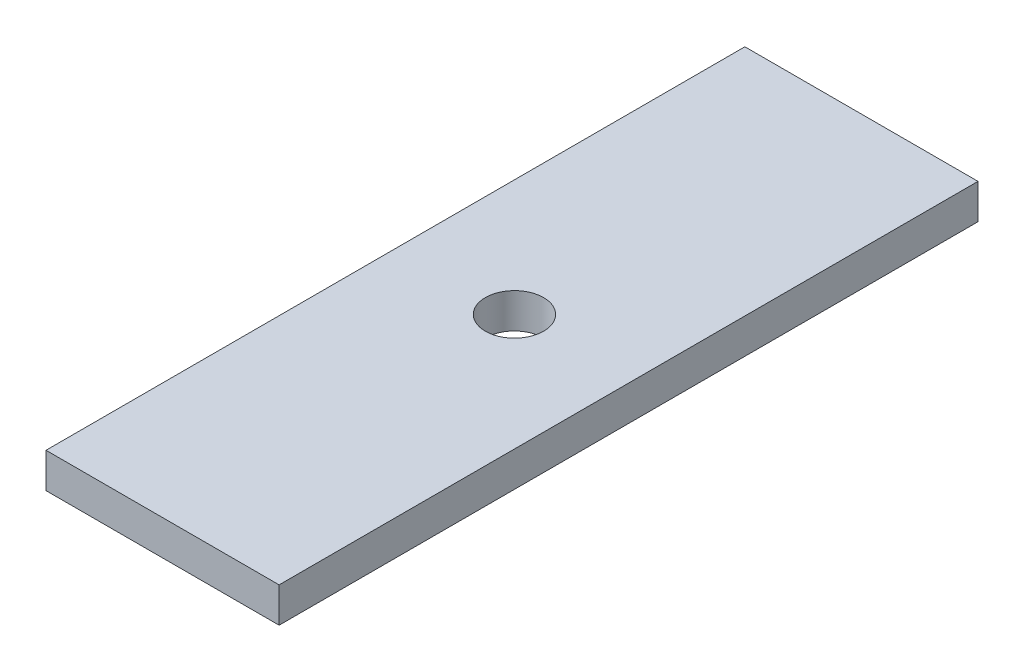
ISO-10303-21;
HEADER;
FILE_DESCRIPTION(('STEP AP214'),'2;1');
FILE_NAME('part.step','',(''),(''),'','','');
FILE_SCHEMA(('AUTOMOTIVE_DESIGN { 1 0 10303 214 1 1 1 1 }'));
ENDSEC;
DATA;
#1=APPLICATION_CONTEXT('core data for automotive mechanical design processes');
#2=APPLICATION_PROTOCOL_DEFINITION('international standard','automotive_design',2000,#1);
#3=PRODUCT_CONTEXT('',#1,'mechanical');
#4=PRODUCT('Part','Part','',(#3));
#5=PRODUCT_RELATED_PRODUCT_CATEGORY('part','',(#4));
#6=PRODUCT_DEFINITION_FORMATION('','',#4);
#7=PRODUCT_DEFINITION_CONTEXT('part definition',#1,'design');
#8=PRODUCT_DEFINITION('design','',#6,#7);
#9=PRODUCT_DEFINITION_SHAPE('','',#8);
#10=(LENGTH_UNIT() NAMED_UNIT(*) SI_UNIT(.MILLI.,.METRE.));
#11=(NAMED_UNIT(*) PLANE_ANGLE_UNIT() SI_UNIT($,.RADIAN.));
#12=(NAMED_UNIT(*) SI_UNIT($,.STERADIAN.) SOLID_ANGLE_UNIT());
#13=UNCERTAINTY_MEASURE_WITH_UNIT(LENGTH_MEASURE(1.E-05),#10,'distance_accuracy_value','');
#14=(GEOMETRIC_REPRESENTATION_CONTEXT(3) GLOBAL_UNCERTAINTY_ASSIGNED_CONTEXT((#13)) GLOBAL_UNIT_ASSIGNED_CONTEXT((#10,
#11,#12)) REPRESENTATION_CONTEXT('',''));
#15=CARTESIAN_POINT('',(0.,0.,0.));
#16=DIRECTION('',(0.,0.,1.));
#17=DIRECTION('',(1.,0.,0.));
#18=AXIS2_PLACEMENT_3D('',#15,#16,#17);
#19=CARTESIAN_POINT('',(0.,3.,0.));
#20=DIRECTION('',(0.,-1.,0.));
#21=DIRECTION('',(0.,0.,-1.));
#22=AXIS2_PLACEMENT_3D('',#19,#20,#21);
#23=PLANE('',#22);
#24=DIRECTION('',(0.,0.,-1.));
#25=VECTOR('',#24,1.);
#26=CARTESIAN_POINT('',(10.,3.,29.97933116567));
#27=LINE('',#26,#25);
#28=CARTESIAN_POINT('',(10.,3.,29.97933116567));
#29=VERTEX_POINT('',#28);
#30=CARTESIAN_POINT('',(10.,3.,-29.97933116567));
#31=VERTEX_POINT('',#30);
#32=EDGE_CURVE('E85',#29,#31,#27,.T.);
#33=ORIENTED_EDGE('',*,*,#32,.T.);
#34=DIRECTION('',(-1.,0.,0.));
#35=VECTOR('',#34,1.);
#36=CARTESIAN_POINT('',(-10.,3.,-29.97933116567));
#37=LINE('',#36,#35);
#38=CARTESIAN_POINT('',(-10.,3.,-29.97933116567));
#39=VERTEX_POINT('',#38);
#40=EDGE_CURVE('E80',#31,#39,#37,.T.);
#41=ORIENTED_EDGE('',*,*,#40,.T.);
#42=DIRECTION('',(0.,0.,1.));
#43=VECTOR('',#42,1.);
#44=CARTESIAN_POINT('',(-10.,3.,29.97933116567));
#45=LINE('',#44,#43);
#46=CARTESIAN_POINT('',(-10.,3.,29.97933116567));
#47=VERTEX_POINT('',#46);
#48=EDGE_CURVE('E83',#39,#47,#45,.T.);
#49=ORIENTED_EDGE('',*,*,#48,.T.);
#50=DIRECTION('',(1.,0.,0.));
#51=VECTOR('',#50,1.);
#52=CARTESIAN_POINT('',(-10.,3.,29.97933116567));
#53=LINE('',#52,#51);
#54=EDGE_CURVE('E50',#47,#29,#53,.T.);
#55=ORIENTED_EDGE('',*,*,#54,.T.);
#56=EDGE_LOOP('',(#33,#41,#49,#55));
#57=FACE_BOUND('',#56,.T.);
#58=CARTESIAN_POINT('',(0.,3.,-0.210000000000002));
#59=DIRECTION('',(0.,1.,0.));
#60=DIRECTION('',(0.,0.,1.));
#61=AXIS2_PLACEMENT_3D('',#58,#59,#60);
#62=CIRCLE('',#61,2.5);
#63=CARTESIAN_POINT('',(0.,3.,2.29));
#64=VERTEX_POINT('',#63);
#65=EDGE_CURVE('E100',#64,#64,#62,.T.);
#66=ORIENTED_EDGE('',*,*,#65,.F.);
#67=EDGE_LOOP('',(#66));
#68=FACE_BOUND('',#67,.T.);
#69=ADVANCED_FACE('F33',(#57,#68),#23,.F.);
#70=CARTESIAN_POINT('',(0.,0.,0.));
#71=DIRECTION('',(0.,-1.,0.));
#72=DIRECTION('',(0.,0.,-1.));
#73=AXIS2_PLACEMENT_3D('',#70,#71,#72);
#74=PLANE('',#73);
#75=DIRECTION('',(0.,0.,-1.));
#76=VECTOR('',#75,1.);
#77=CARTESIAN_POINT('',(10.,0.,29.97933116567));
#78=LINE('',#77,#76);
#79=CARTESIAN_POINT('',(10.,0.,29.97933116567));
#80=VERTEX_POINT('',#79);
#81=CARTESIAN_POINT('',(10.,0.,-29.97933116567));
#82=VERTEX_POINT('',#81);
#83=EDGE_CURVE('E97',#80,#82,#78,.T.);
#84=ORIENTED_EDGE('',*,*,#83,.F.);
#85=DIRECTION('',(1.,0.,0.));
#86=VECTOR('',#85,1.);
#87=CARTESIAN_POINT('',(-10.,0.,29.97933116567));
#88=LINE('',#87,#86);
#89=CARTESIAN_POINT('',(-10.,0.,29.97933116567));
#90=VERTEX_POINT('',#89);
#91=EDGE_CURVE('E73',#90,#80,#88,.T.);
#92=ORIENTED_EDGE('',*,*,#91,.F.);
#93=DIRECTION('',(0.,0.,1.));
#94=VECTOR('',#93,1.);
#95=CARTESIAN_POINT('',(-10.,0.,29.97933116567));
#96=LINE('',#95,#94);
#97=CARTESIAN_POINT('',(-10.,0.,-29.97933116567));
#98=VERTEX_POINT('',#97);
#99=EDGE_CURVE('E67',#98,#90,#96,.T.);
#100=ORIENTED_EDGE('',*,*,#99,.F.);
#101=DIRECTION('',(-1.,0.,0.));
#102=VECTOR('',#101,1.);
#103=CARTESIAN_POINT('',(-10.,0.,-29.97933116567));
#104=LINE('',#103,#102);
#105=EDGE_CURVE('E89',#82,#98,#104,.T.);
#106=ORIENTED_EDGE('',*,*,#105,.F.);
#107=EDGE_LOOP('',(#84,#92,#100,#106));
#108=FACE_BOUND('',#107,.T.);
#109=CARTESIAN_POINT('',(0.,0.,-0.210000000000002));
#110=DIRECTION('',(0.,1.,0.));
#111=DIRECTION('',(0.,0.,1.));
#112=AXIS2_PLACEMENT_3D('',#109,#110,#111);
#113=CIRCLE('',#112,2.5);
#114=CARTESIAN_POINT('',(0.,0.,2.29));
#115=VERTEX_POINT('',#114);
#116=EDGE_CURVE('E112',#115,#115,#113,.T.);
#117=ORIENTED_EDGE('',*,*,#116,.T.);
#118=EDGE_LOOP('',(#117));
#119=FACE_BOUND('',#118,.T.);
#120=ADVANCED_FACE('F108',(#108,#119),#74,.T.);
#121=CARTESIAN_POINT('',(10.,3.,29.97933116567));
#122=DIRECTION('',(-1.,0.,0.));
#123=DIRECTION('',(0.,0.,1.));
#124=AXIS2_PLACEMENT_3D('',#121,#122,#123);
#125=PLANE('',#124);
#126=ORIENTED_EDGE('',*,*,#83,.T.);
#127=DIRECTION('',(0.,-1.,0.));
#128=VECTOR('',#127,1.);
#129=CARTESIAN_POINT('',(10.,3.,-29.97933116567));
#130=LINE('',#129,#128);
#131=EDGE_CURVE('E11',#31,#82,#130,.T.);
#132=ORIENTED_EDGE('',*,*,#131,.F.);
#133=ORIENTED_EDGE('',*,*,#32,.F.);
#134=DIRECTION('',(0.,-1.,0.));
#135=VECTOR('',#134,1.);
#136=CARTESIAN_POINT('',(10.,3.,29.97933116567));
#137=LINE('',#136,#135);
#138=EDGE_CURVE('E93',#29,#80,#137,.T.);
#139=ORIENTED_EDGE('',*,*,#138,.T.);
#140=EDGE_LOOP('',(#126,#132,#133,#139));
#141=FACE_BOUND('',#140,.T.);
#142=ADVANCED_FACE('F35',(#141),#125,.F.);
#143=CARTESIAN_POINT('',(-10.,3.,-29.97933116567));
#144=DIRECTION('',(0.,0.,1.));
#145=DIRECTION('',(1.,0.,0.));
#146=AXIS2_PLACEMENT_3D('',#143,#144,#145);
#147=PLANE('',#146);
#148=ORIENTED_EDGE('',*,*,#105,.T.);
#149=DIRECTION('',(0.,-1.,0.));
#150=VECTOR('',#149,1.);
#151=CARTESIAN_POINT('',(-10.,3.,-29.97933116567));
#152=LINE('',#151,#150);
#153=EDGE_CURVE('E42',#39,#98,#152,.T.);
#154=ORIENTED_EDGE('',*,*,#153,.F.);
#155=ORIENTED_EDGE('',*,*,#40,.F.);
#156=ORIENTED_EDGE('',*,*,#131,.T.);
#157=EDGE_LOOP('',(#148,#154,#155,#156));
#158=FACE_BOUND('',#157,.T.);
#159=ADVANCED_FACE('F88',(#158),#147,.F.);
#160=CARTESIAN_POINT('',(-10.,3.,29.97933116567));
#161=DIRECTION('',(1.,0.,0.));
#162=DIRECTION('',(0.,0.,-1.));
#163=AXIS2_PLACEMENT_3D('',#160,#161,#162);
#164=PLANE('',#163);
#165=ORIENTED_EDGE('',*,*,#99,.T.);
#166=DIRECTION('',(0.,-1.,0.));
#167=VECTOR('',#166,1.);
#168=CARTESIAN_POINT('',(-10.,3.,29.97933116567));
#169=LINE('',#168,#167);
#170=EDGE_CURVE('E90',#47,#90,#169,.T.);
#171=ORIENTED_EDGE('',*,*,#170,.F.);
#172=ORIENTED_EDGE('',*,*,#48,.F.);
#173=ORIENTED_EDGE('',*,*,#153,.T.);
#174=EDGE_LOOP('',(#165,#171,#172,#173));
#175=FACE_BOUND('',#174,.T.);
#176=ADVANCED_FACE('F91',(#175),#164,.F.);
#177=CARTESIAN_POINT('',(-10.,3.,29.97933116567));
#178=DIRECTION('',(0.,0.,-1.));
#179=DIRECTION('',(-1.,0.,0.));
#180=AXIS2_PLACEMENT_3D('',#177,#178,#179);
#181=PLANE('',#180);
#182=ORIENTED_EDGE('',*,*,#91,.T.);
#183=ORIENTED_EDGE('',*,*,#138,.F.);
#184=ORIENTED_EDGE('',*,*,#54,.F.);
#185=ORIENTED_EDGE('',*,*,#170,.T.);
#186=EDGE_LOOP('',(#182,#183,#184,#185));
#187=FACE_BOUND('',#186,.T.);
#188=ADVANCED_FACE('F105',(#187),#181,.F.);
#189=CARTESIAN_POINT('',(0.,3.,-0.210000000000002));
#190=DIRECTION('',(0.,-1.,0.));
#191=DIRECTION('',(0.,0.,-1.));
#192=AXIS2_PLACEMENT_3D('',#189,#190,#191);
#193=CYLINDRICAL_SURFACE('',#192,2.5);
#194=ORIENTED_EDGE('',*,*,#65,.T.);
#195=EDGE_LOOP('',(#194));
#196=FACE_BOUND('',#195,.T.);
#197=ORIENTED_EDGE('',*,*,#116,.F.);
#198=EDGE_LOOP('',(#197));
#199=FACE_BOUND('',#198,.T.);
#200=ADVANCED_FACE('F118',(#196,#199),#193,.F.);
#201=CLOSED_SHELL('',(#69,#120,#142,#159,#176,#188,#200));
#202=MANIFOLD_SOLID_BREP('B2',#201);
#203=ADVANCED_BREP_SHAPE_REPRESENTATION('',(#18,#202),#14);
#204=SHAPE_DEFINITION_REPRESENTATION(#9,#203);
ENDSEC;
END-ISO-10303-21;
